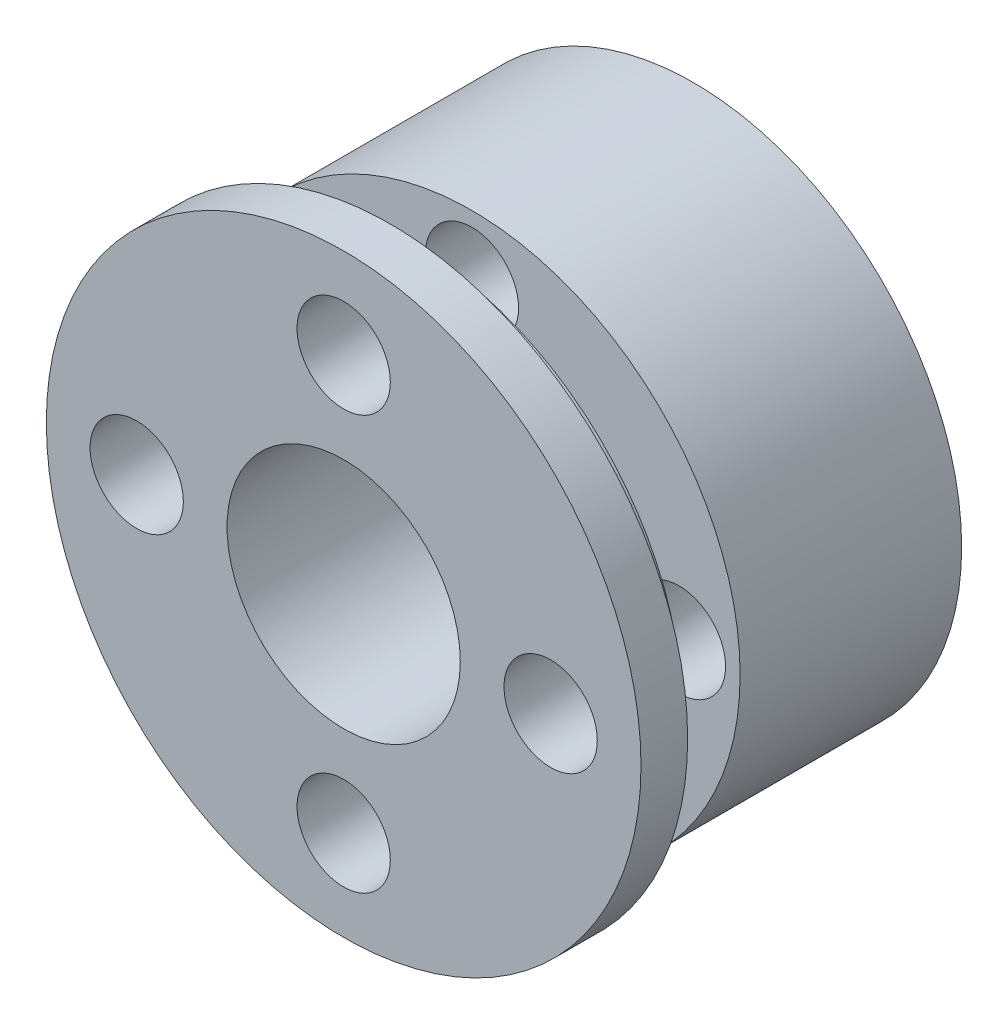
ISO-10303-21;
HEADER;
FILE_DESCRIPTION(('STEP AP214'),'2;1');
FILE_NAME('part.step','',(''),(''),'','','');
FILE_SCHEMA(('AUTOMOTIVE_DESIGN { 1 0 10303 214 1 1 1 1 }'));
ENDSEC;
DATA;
#1=APPLICATION_CONTEXT('core data for automotive mechanical design processes');
#2=APPLICATION_PROTOCOL_DEFINITION('international standard','automotive_design',2000,#1);
#3=PRODUCT_CONTEXT('',#1,'mechanical');
#4=PRODUCT('Part','Part','',(#3));
#5=PRODUCT_RELATED_PRODUCT_CATEGORY('part','',(#4));
#6=PRODUCT_DEFINITION_FORMATION('','',#4);
#7=PRODUCT_DEFINITION_CONTEXT('part definition',#1,'design');
#8=PRODUCT_DEFINITION('design','',#6,#7);
#9=PRODUCT_DEFINITION_SHAPE('','',#8);
#10=(LENGTH_UNIT() NAMED_UNIT(*) SI_UNIT(.MILLI.,.METRE.));
#11=(NAMED_UNIT(*) PLANE_ANGLE_UNIT() SI_UNIT($,.RADIAN.));
#12=(NAMED_UNIT(*) SI_UNIT($,.STERADIAN.) SOLID_ANGLE_UNIT());
#13=UNCERTAINTY_MEASURE_WITH_UNIT(LENGTH_MEASURE(1.E-05),#10,'distance_accuracy_value','');
#14=(GEOMETRIC_REPRESENTATION_CONTEXT(3) GLOBAL_UNCERTAINTY_ASSIGNED_CONTEXT((#13)) GLOBAL_UNIT_ASSIGNED_CONTEXT((#10,
#11,#12)) REPRESENTATION_CONTEXT('',''));
#15=CARTESIAN_POINT('',(0.,0.,0.));
#16=DIRECTION('',(0.,0.,1.));
#17=DIRECTION('',(1.,0.,0.));
#18=AXIS2_PLACEMENT_3D('',#15,#16,#17);
#19=CARTESIAN_POINT('',(0.,0.,0.));
#20=DIRECTION('',(0.,0.,1.));
#21=DIRECTION('',(1.,0.,0.));
#22=AXIS2_PLACEMENT_3D('',#19,#20,#21);
#23=PLANE('',#22);
#24=CARTESIAN_POINT('',(0.,8.875,0.));
#25=DIRECTION('',(0.,0.,1.));
#26=DIRECTION('',(1.,0.,0.));
#27=AXIS2_PLACEMENT_3D('',#24,#25,#26);
#28=CIRCLE('',#27,2.);
#29=CARTESIAN_POINT('',(2.,8.875,0.));
#30=VERTEX_POINT('',#29);
#31=EDGE_CURVE('E92',#30,#30,#28,.T.);
#32=ORIENTED_EDGE('',*,*,#31,.T.);
#33=EDGE_LOOP('',(#32));
#34=FACE_BOUND('',#33,.T.);
#35=CARTESIAN_POINT('',(8.87500000000025,2.50612360143471E-13,0.));
#36=DIRECTION('',(0.,0.,1.));
#37=DIRECTION('',(1.,0.,0.));
#38=AXIS2_PLACEMENT_3D('',#35,#36,#37);
#39=CIRCLE('',#38,2.0000000000002);
#40=CARTESIAN_POINT('',(10.8750000000004,2.50612360143471E-13,0.));
#41=VERTEX_POINT('',#40);
#42=EDGE_CURVE('E108',#41,#41,#39,.T.);
#43=ORIENTED_EDGE('',*,*,#42,.T.);
#44=EDGE_LOOP('',(#43));
#45=FACE_BOUND('',#44,.T.);
#46=CARTESIAN_POINT('',(5.01224720286941E-13,-8.875,0.));
#47=DIRECTION('',(0.,0.,1.));
#48=DIRECTION('',(1.,0.,0.));
#49=AXIS2_PLACEMENT_3D('',#46,#47,#48);
#50=CIRCLE('',#49,2.00000000000054);
#51=CARTESIAN_POINT('',(2.00000000000104,-8.875,0.));
#52=VERTEX_POINT('',#51);
#53=EDGE_CURVE('E102',#52,#52,#50,.T.);
#54=ORIENTED_EDGE('',*,*,#53,.T.);
#55=EDGE_LOOP('',(#54));
#56=FACE_BOUND('',#55,.T.);
#57=CARTESIAN_POINT('',(-8.87499999999975,-2.51699234177714E-13,0.));
#58=DIRECTION('',(0.,0.,1.));
#59=DIRECTION('',(1.,0.,0.));
#60=AXIS2_PLACEMENT_3D('',#57,#58,#59);
#61=CIRCLE('',#60,2.0000000000004);
#62=CARTESIAN_POINT('',(-6.87499999999935,-2.51699234177714E-13,0.));
#63=VERTEX_POINT('',#62);
#64=EDGE_CURVE('E96',#63,#63,#61,.T.);
#65=ORIENTED_EDGE('',*,*,#64,.T.);
#66=EDGE_LOOP('',(#65));
#67=FACE_BOUND('',#66,.T.);
#68=CARTESIAN_POINT('',(0.,0.,0.));
#69=DIRECTION('',(0.,0.,1.));
#70=DIRECTION('',(1.,0.,0.));
#71=AXIS2_PLACEMENT_3D('',#68,#69,#70);
#72=CIRCLE('',#71,5.);
#73=CARTESIAN_POINT('',(5.,0.,0.));
#74=VERTEX_POINT('',#73);
#75=EDGE_CURVE('E62',#74,#74,#72,.T.);
#76=ORIENTED_EDGE('',*,*,#75,.T.);
#77=EDGE_LOOP('',(#76));
#78=FACE_BOUND('',#77,.T.);
#79=CARTESIAN_POINT('',(0.,0.,0.));
#80=DIRECTION('',(0.,0.,1.));
#81=DIRECTION('',(1.,0.,0.));
#82=AXIS2_PLACEMENT_3D('',#79,#80,#81);
#83=CIRCLE('',#82,11.5);
#84=CARTESIAN_POINT('',(11.5,0.,0.));
#85=VERTEX_POINT('',#84);
#86=EDGE_CURVE('E10',#85,#85,#83,.T.);
#87=ORIENTED_EDGE('',*,*,#86,.F.);
#88=EDGE_LOOP('',(#87));
#89=FACE_BOUND('',#88,.T.);
#90=ADVANCED_FACE('F31',(#34,#45,#56,#67,#78,#89),#23,.F.);
#91=CARTESIAN_POINT('',(0.,0.,15.));
#92=DIRECTION('',(0.,0.,1.));
#93=DIRECTION('',(1.,0.,0.));
#94=AXIS2_PLACEMENT_3D('',#91,#92,#93);
#95=CYLINDRICAL_SURFACE('',#94,11.5);
#96=CARTESIAN_POINT('',(0.,0.,9.5));
#97=DIRECTION('',(0.,0.,1.));
#98=DIRECTION('',(1.,0.,0.));
#99=AXIS2_PLACEMENT_3D('',#96,#97,#98);
#100=CIRCLE('',#99,11.5);
#101=CARTESIAN_POINT('',(11.5,0.,9.5));
#102=VERTEX_POINT('',#101);
#103=EDGE_CURVE('E37',#102,#102,#100,.T.);
#104=ORIENTED_EDGE('',*,*,#103,.F.);
#105=EDGE_LOOP('',(#104));
#106=FACE_BOUND('',#105,.T.);
#107=ORIENTED_EDGE('',*,*,#86,.T.);
#108=EDGE_LOOP('',(#107));
#109=FACE_BOUND('',#108,.T.);
#110=ADVANCED_FACE('F131',(#106,#109),#95,.T.);
#111=CARTESIAN_POINT('',(0.,11.5,9.5));
#112=DIRECTION('',(0.,0.,-1.));
#113=DIRECTION('',(-1.,0.,0.));
#114=AXIS2_PLACEMENT_3D('',#111,#112,#113);
#115=PLANE('',#114);
#116=CARTESIAN_POINT('',(0.,8.875,9.5));
#117=DIRECTION('',(0.,0.,-1.));
#118=DIRECTION('',(-1.,0.,0.));
#119=AXIS2_PLACEMENT_3D('',#116,#117,#118);
#120=CIRCLE('',#119,2.);
#121=CARTESIAN_POINT('',(-2.,8.875,9.5));
#122=VERTEX_POINT('',#121);
#123=EDGE_CURVE('E66',#122,#122,#120,.T.);
#124=ORIENTED_EDGE('',*,*,#123,.T.);
#125=EDGE_LOOP('',(#124));
#126=FACE_BOUND('',#125,.T.);
#127=CARTESIAN_POINT('',(8.87500000000025,2.50612360143471E-13,9.5));
#128=DIRECTION('',(0.,0.,-1.));
#129=DIRECTION('',(-1.,0.,0.));
#130=AXIS2_PLACEMENT_3D('',#127,#128,#129);
#131=CIRCLE('',#130,2.0000000000002);
#132=CARTESIAN_POINT('',(6.87500000000005,2.50612360143471E-13,9.5));
#133=VERTEX_POINT('',#132);
#134=EDGE_CURVE('E74',#133,#133,#131,.T.);
#135=ORIENTED_EDGE('',*,*,#134,.T.);
#136=EDGE_LOOP('',(#135));
#137=FACE_BOUND('',#136,.T.);
#138=CARTESIAN_POINT('',(5.01224720286941E-13,-8.875,9.5));
#139=DIRECTION('',(0.,0.,-1.));
#140=DIRECTION('',(-1.,0.,0.));
#141=AXIS2_PLACEMENT_3D('',#138,#139,#140);
#142=CIRCLE('',#141,2.00000000000054);
#143=CARTESIAN_POINT('',(-2.00000000000004,-8.875,9.5));
#144=VERTEX_POINT('',#143);
#145=EDGE_CURVE('E80',#144,#144,#142,.T.);
#146=ORIENTED_EDGE('',*,*,#145,.T.);
#147=EDGE_LOOP('',(#146));
#148=FACE_BOUND('',#147,.T.);
#149=CARTESIAN_POINT('',(-8.87499999999975,-2.51699234177714E-13,9.5));
#150=DIRECTION('',(0.,0.,-1.));
#151=DIRECTION('',(-1.,0.,0.));
#152=AXIS2_PLACEMENT_3D('',#149,#150,#151);
#153=CIRCLE('',#152,2.0000000000004);
#154=CARTESIAN_POINT('',(-10.8750000000002,-2.51699234177714E-13,9.5));
#155=VERTEX_POINT('',#154);
#156=EDGE_CURVE('E86',#155,#155,#153,.T.);
#157=ORIENTED_EDGE('',*,*,#156,.T.);
#158=EDGE_LOOP('',(#157));
#159=FACE_BOUND('',#158,.T.);
#160=CARTESIAN_POINT('',(0.,0.,9.5));
#161=DIRECTION('',(0.,0.,1.));
#162=DIRECTION('',(1.,0.,0.));
#163=AXIS2_PLACEMENT_3D('',#160,#161,#162);
#164=CIRCLE('',#163,6.);
#165=CARTESIAN_POINT('',(6.,0.,9.5));
#166=VERTEX_POINT('',#165);
#167=EDGE_CURVE('E41',#166,#166,#164,.T.);
#168=ORIENTED_EDGE('',*,*,#167,.F.);
#169=EDGE_LOOP('',(#168));
#170=FACE_BOUND('',#169,.T.);
#171=ORIENTED_EDGE('',*,*,#103,.T.);
#172=EDGE_LOOP('',(#171));
#173=FACE_BOUND('',#172,.T.);
#174=ADVANCED_FACE('F127',(#126,#137,#148,#159,#170,#173),#115,.F.);
#175=CARTESIAN_POINT('',(0.,0.,15.));
#176=DIRECTION('',(0.,0.,1.));
#177=DIRECTION('',(1.,0.,0.));
#178=AXIS2_PLACEMENT_3D('',#175,#176,#177);
#179=CYLINDRICAL_SURFACE('',#178,6.);
#180=CARTESIAN_POINT('',(0.,0.,12.));
#181=DIRECTION('',(0.,0.,1.));
#182=DIRECTION('',(1.,0.,0.));
#183=AXIS2_PLACEMENT_3D('',#180,#181,#182);
#184=CIRCLE('',#183,6.);
#185=CARTESIAN_POINT('',(6.,0.,12.));
#186=VERTEX_POINT('',#185);
#187=EDGE_CURVE('E45',#186,#186,#184,.T.);
#188=ORIENTED_EDGE('',*,*,#187,.F.);
#189=EDGE_LOOP('',(#188));
#190=FACE_BOUND('',#189,.T.);
#191=ORIENTED_EDGE('',*,*,#167,.T.);
#192=EDGE_LOOP('',(#191));
#193=FACE_BOUND('',#192,.T.);
#194=ADVANCED_FACE('F130',(#190,#193),#179,.T.);
#195=CARTESIAN_POINT('',(0.,6.,12.));
#196=DIRECTION('',(0.,0.,1.));
#197=DIRECTION('',(1.,0.,0.));
#198=AXIS2_PLACEMENT_3D('',#195,#196,#197);
#199=PLANE('',#198);
#200=CARTESIAN_POINT('',(0.,8.875,12.));
#201=DIRECTION('',(0.,0.,1.));
#202=DIRECTION('',(1.,0.,0.));
#203=AXIS2_PLACEMENT_3D('',#200,#201,#202);
#204=CIRCLE('',#203,2.);
#205=CARTESIAN_POINT('',(2.,8.875,12.));
#206=VERTEX_POINT('',#205);
#207=EDGE_CURVE('E71',#206,#206,#204,.T.);
#208=ORIENTED_EDGE('',*,*,#207,.T.);
#209=EDGE_LOOP('',(#208));
#210=FACE_BOUND('',#209,.T.);
#211=CARTESIAN_POINT('',(8.87500000000025,2.50612360143471E-13,12.));
#212=DIRECTION('',(0.,0.,1.));
#213=DIRECTION('',(1.,0.,0.));
#214=AXIS2_PLACEMENT_3D('',#211,#212,#213);
#215=CIRCLE('',#214,2.0000000000002);
#216=CARTESIAN_POINT('',(10.8750000000004,2.50612360143471E-13,12.));
#217=VERTEX_POINT('',#216);
#218=EDGE_CURVE('E77',#217,#217,#215,.T.);
#219=ORIENTED_EDGE('',*,*,#218,.T.);
#220=EDGE_LOOP('',(#219));
#221=FACE_BOUND('',#220,.T.);
#222=CARTESIAN_POINT('',(5.01224720286941E-13,-8.875,12.));
#223=DIRECTION('',(0.,0.,1.));
#224=DIRECTION('',(1.,0.,0.));
#225=AXIS2_PLACEMENT_3D('',#222,#223,#224);
#226=CIRCLE('',#225,2.00000000000054);
#227=CARTESIAN_POINT('',(2.00000000000104,-8.875,12.));
#228=VERTEX_POINT('',#227);
#229=EDGE_CURVE('E83',#228,#228,#226,.T.);
#230=ORIENTED_EDGE('',*,*,#229,.T.);
#231=EDGE_LOOP('',(#230));
#232=FACE_BOUND('',#231,.T.);
#233=CARTESIAN_POINT('',(-8.87499999999975,-2.51699234177714E-13,12.));
#234=DIRECTION('',(0.,0.,1.));
#235=DIRECTION('',(1.,0.,0.));
#236=AXIS2_PLACEMENT_3D('',#233,#234,#235);
#237=CIRCLE('',#236,2.0000000000004);
#238=CARTESIAN_POINT('',(-6.87499999999935,-2.51699234177714E-13,12.));
#239=VERTEX_POINT('',#238);
#240=EDGE_CURVE('E89',#239,#239,#237,.T.);
#241=ORIENTED_EDGE('',*,*,#240,.T.);
#242=EDGE_LOOP('',(#241));
#243=FACE_BOUND('',#242,.T.);
#244=CARTESIAN_POINT('',(0.,0.,12.));
#245=DIRECTION('',(0.,0.,1.));
#246=DIRECTION('',(1.,0.,0.));
#247=AXIS2_PLACEMENT_3D('',#244,#245,#246);
#248=CIRCLE('',#247,11.5);
#249=CARTESIAN_POINT('',(11.5,0.,12.));
#250=VERTEX_POINT('',#249);
#251=EDGE_CURVE('E50',#250,#250,#248,.T.);
#252=ORIENTED_EDGE('',*,*,#251,.F.);
#253=EDGE_LOOP('',(#252));
#254=FACE_BOUND('',#253,.T.);
#255=ORIENTED_EDGE('',*,*,#187,.T.);
#256=EDGE_LOOP('',(#255));
#257=FACE_BOUND('',#256,.T.);
#258=ADVANCED_FACE('F142',(#210,#221,#232,#243,#254,#257),#199,.F.);
#259=CARTESIAN_POINT('',(0.,0.,15.));
#260=DIRECTION('',(0.,0.,1.));
#261=DIRECTION('',(1.,0.,0.));
#262=AXIS2_PLACEMENT_3D('',#259,#260,#261);
#263=CYLINDRICAL_SURFACE('',#262,11.5);
#264=CARTESIAN_POINT('',(0.,0.,13.));
#265=DIRECTION('',(0.,0.,1.));
#266=DIRECTION('',(1.,0.,0.));
#267=AXIS2_PLACEMENT_3D('',#264,#265,#266);
#268=CIRCLE('',#267,11.5);
#269=CARTESIAN_POINT('',(11.5,0.,13.));
#270=VERTEX_POINT('',#269);
#271=EDGE_CURVE('E53',#270,#270,#268,.T.);
#272=ORIENTED_EDGE('',*,*,#271,.F.);
#273=EDGE_LOOP('',(#272));
#274=FACE_BOUND('',#273,.T.);
#275=ORIENTED_EDGE('',*,*,#251,.T.);
#276=EDGE_LOOP('',(#275));
#277=FACE_BOUND('',#276,.T.);
#278=ADVANCED_FACE('F148',(#274,#277),#263,.T.);
#279=CARTESIAN_POINT('',(0.,11.5,13.));
#280=DIRECTION('',(0.,0.,1.));
#281=DIRECTION('',(1.,0.,0.));
#282=AXIS2_PLACEMENT_3D('',#279,#280,#281);
#283=PLANE('',#282);
#284=CARTESIAN_POINT('',(0.,0.,13.));
#285=DIRECTION('',(0.,0.,1.));
#286=DIRECTION('',(1.,0.,0.));
#287=AXIS2_PLACEMENT_3D('',#284,#285,#286);
#288=CIRCLE('',#287,12.75);
#289=CARTESIAN_POINT('',(12.75,0.,13.));
#290=VERTEX_POINT('',#289);
#291=EDGE_CURVE('E56',#290,#290,#288,.T.);
#292=ORIENTED_EDGE('',*,*,#291,.F.);
#293=EDGE_LOOP('',(#292));
#294=FACE_BOUND('',#293,.T.);
#295=ORIENTED_EDGE('',*,*,#271,.T.);
#296=EDGE_LOOP('',(#295));
#297=FACE_BOUND('',#296,.T.);
#298=ADVANCED_FACE('F271',(#294,#297),#283,.F.);
#299=CARTESIAN_POINT('',(0.,0.,15.));
#300=DIRECTION('',(0.,0.,1.));
#301=DIRECTION('',(1.,0.,0.));
#302=AXIS2_PLACEMENT_3D('',#299,#300,#301);
#303=CYLINDRICAL_SURFACE('',#302,12.75);
#304=CARTESIAN_POINT('',(0.,0.,15.));
#305=DIRECTION('',(0.,0.,1.));
#306=DIRECTION('',(1.,0.,0.));
#307=AXIS2_PLACEMENT_3D('',#304,#305,#306);
#308=CIRCLE('',#307,12.75);
#309=CARTESIAN_POINT('',(12.75,0.,15.));
#310=VERTEX_POINT('',#309);
#311=EDGE_CURVE('E59',#310,#310,#308,.T.);
#312=ORIENTED_EDGE('',*,*,#311,.F.);
#313=EDGE_LOOP('',(#312));
#314=FACE_BOUND('',#313,.T.);
#315=ORIENTED_EDGE('',*,*,#291,.T.);
#316=EDGE_LOOP('',(#315));
#317=FACE_BOUND('',#316,.T.);
#318=ADVANCED_FACE('F186',(#314,#317),#303,.T.);
#319=CARTESIAN_POINT('',(0.,12.75,15.));
#320=DIRECTION('',(0.,0.,-1.));
#321=DIRECTION('',(-1.,0.,0.));
#322=AXIS2_PLACEMENT_3D('',#319,#320,#321);
#323=PLANE('',#322);
#324=CARTESIAN_POINT('',(0.,8.875,15.));
#325=DIRECTION('',(0.,0.,1.));
#326=DIRECTION('',(1.,0.,0.));
#327=AXIS2_PLACEMENT_3D('',#324,#325,#326);
#328=CIRCLE('',#327,2.);
#329=CARTESIAN_POINT('',(2.,8.875,15.));
#330=VERTEX_POINT('',#329);
#331=EDGE_CURVE('E111',#330,#330,#328,.T.);
#332=ORIENTED_EDGE('',*,*,#331,.F.);
#333=EDGE_LOOP('',(#332));
#334=FACE_BOUND('',#333,.T.);
#335=CARTESIAN_POINT('',(8.87500000000025,2.50612360143471E-13,15.));
#336=DIRECTION('',(0.,0.,1.));
#337=DIRECTION('',(1.,0.,0.));
#338=AXIS2_PLACEMENT_3D('',#335,#336,#337);
#339=CIRCLE('',#338,2.0000000000002);
#340=CARTESIAN_POINT('',(10.8750000000004,2.50612360143471E-13,15.));
#341=VERTEX_POINT('',#340);
#342=EDGE_CURVE('E105',#341,#341,#339,.T.);
#343=ORIENTED_EDGE('',*,*,#342,.F.);
#344=EDGE_LOOP('',(#343));
#345=FACE_BOUND('',#344,.T.);
#346=CARTESIAN_POINT('',(5.01224720286941E-13,-8.875,15.));
#347=DIRECTION('',(0.,0.,1.));
#348=DIRECTION('',(1.,0.,0.));
#349=AXIS2_PLACEMENT_3D('',#346,#347,#348);
#350=CIRCLE('',#349,2.00000000000054);
#351=CARTESIAN_POINT('',(2.00000000000104,-8.875,15.));
#352=VERTEX_POINT('',#351);
#353=EDGE_CURVE('E99',#352,#352,#350,.T.);
#354=ORIENTED_EDGE('',*,*,#353,.F.);
#355=EDGE_LOOP('',(#354));
#356=FACE_BOUND('',#355,.T.);
#357=CARTESIAN_POINT('',(-8.87499999999975,-2.51699234177714E-13,15.));
#358=DIRECTION('',(0.,0.,1.));
#359=DIRECTION('',(1.,0.,0.));
#360=AXIS2_PLACEMENT_3D('',#357,#358,#359);
#361=CIRCLE('',#360,2.0000000000004);
#362=CARTESIAN_POINT('',(-6.87499999999935,-2.51699234177714E-13,15.));
#363=VERTEX_POINT('',#362);
#364=EDGE_CURVE('E93',#363,#363,#361,.T.);
#365=ORIENTED_EDGE('',*,*,#364,.F.);
#366=EDGE_LOOP('',(#365));
#367=FACE_BOUND('',#366,.T.);
#368=CARTESIAN_POINT('',(0.,0.,15.));
#369=DIRECTION('',(0.,0.,1.));
#370=DIRECTION('',(1.,0.,0.));
#371=AXIS2_PLACEMENT_3D('',#368,#369,#370);
#372=CIRCLE('',#371,5.);
#373=CARTESIAN_POINT('',(5.,0.,15.));
#374=VERTEX_POINT('',#373);
#375=EDGE_CURVE('E63',#374,#374,#372,.T.);
#376=ORIENTED_EDGE('',*,*,#375,.F.);
#377=EDGE_LOOP('',(#376));
#378=FACE_BOUND('',#377,.T.);
#379=ORIENTED_EDGE('',*,*,#311,.T.);
#380=EDGE_LOOP('',(#379));
#381=FACE_BOUND('',#380,.T.);
#382=ADVANCED_FACE('F180',(#334,#345,#356,#367,#378,#381),#323,.F.);
#383=CARTESIAN_POINT('',(0.,0.,0.));
#384=DIRECTION('',(0.,0.,1.));
#385=DIRECTION('',(1.,0.,0.));
#386=AXIS2_PLACEMENT_3D('',#383,#384,#385);
#387=CYLINDRICAL_SURFACE('',#386,5.);
#388=ORIENTED_EDGE('',*,*,#75,.F.);
#389=EDGE_LOOP('',(#388));
#390=FACE_BOUND('',#389,.T.);
#391=ORIENTED_EDGE('',*,*,#375,.T.);
#392=EDGE_LOOP('',(#391));
#393=FACE_BOUND('',#392,.T.);
#394=ADVANCED_FACE('F185',(#390,#393),#387,.F.);
#395=CARTESIAN_POINT('',(-8.87499999999975,-2.51699234177714E-13,0.));
#396=DIRECTION('',(0.,0.,1.));
#397=DIRECTION('',(1.,0.,0.));
#398=AXIS2_PLACEMENT_3D('',#395,#396,#397);
#399=CYLINDRICAL_SURFACE('',#398,2.0000000000004);
#400=ORIENTED_EDGE('',*,*,#364,.T.);
#401=EDGE_LOOP('',(#400));
#402=FACE_BOUND('',#401,.T.);
#403=ORIENTED_EDGE('',*,*,#240,.F.);
#404=EDGE_LOOP('',(#403));
#405=FACE_BOUND('',#404,.T.);
#406=ADVANCED_FACE('F196',(#402,#405),#399,.F.);
#407=CARTESIAN_POINT('',(5.01224720286941E-13,-8.875,0.));
#408=DIRECTION('',(0.,0.,1.));
#409=DIRECTION('',(1.,0.,0.));
#410=AXIS2_PLACEMENT_3D('',#407,#408,#409);
#411=CYLINDRICAL_SURFACE('',#410,2.00000000000054);
#412=ORIENTED_EDGE('',*,*,#353,.T.);
#413=EDGE_LOOP('',(#412));
#414=FACE_BOUND('',#413,.T.);
#415=ORIENTED_EDGE('',*,*,#229,.F.);
#416=EDGE_LOOP('',(#415));
#417=FACE_BOUND('',#416,.T.);
#418=ADVANCED_FACE('F201',(#414,#417),#411,.F.);
#419=CARTESIAN_POINT('',(8.87500000000025,2.50612360143471E-13,0.));
#420=DIRECTION('',(0.,0.,1.));
#421=DIRECTION('',(1.,0.,0.));
#422=AXIS2_PLACEMENT_3D('',#419,#420,#421);
#423=CYLINDRICAL_SURFACE('',#422,2.0000000000002);
#424=ORIENTED_EDGE('',*,*,#342,.T.);
#425=EDGE_LOOP('',(#424));
#426=FACE_BOUND('',#425,.T.);
#427=ORIENTED_EDGE('',*,*,#218,.F.);
#428=EDGE_LOOP('',(#427));
#429=FACE_BOUND('',#428,.T.);
#430=ADVANCED_FACE('F212',(#426,#429),#423,.F.);
#431=CARTESIAN_POINT('',(0.,8.875,0.));
#432=DIRECTION('',(0.,0.,1.));
#433=DIRECTION('',(1.,0.,0.));
#434=AXIS2_PLACEMENT_3D('',#431,#432,#433);
#435=CYLINDRICAL_SURFACE('',#434,2.);
#436=ORIENTED_EDGE('',*,*,#331,.T.);
#437=EDGE_LOOP('',(#436));
#438=FACE_BOUND('',#437,.T.);
#439=ORIENTED_EDGE('',*,*,#207,.F.);
#440=EDGE_LOOP('',(#439));
#441=FACE_BOUND('',#440,.T.);
#442=ADVANCED_FACE('F124',(#438,#441),#435,.F.);
#443=ORIENTED_EDGE('',*,*,#64,.F.);
#444=EDGE_LOOP('',(#443));
#445=FACE_BOUND('',#444,.T.);
#446=ORIENTED_EDGE('',*,*,#156,.F.);
#447=EDGE_LOOP('',(#446));
#448=FACE_BOUND('',#447,.T.);
#449=ADVANCED_FACE('F204',(#445,#448),#399,.F.);
#450=ORIENTED_EDGE('',*,*,#53,.F.);
#451=EDGE_LOOP('',(#450));
#452=FACE_BOUND('',#451,.T.);
#453=ORIENTED_EDGE('',*,*,#145,.F.);
#454=EDGE_LOOP('',(#453));
#455=FACE_BOUND('',#454,.T.);
#456=ADVANCED_FACE('F215',(#452,#455),#411,.F.);
#457=ORIENTED_EDGE('',*,*,#42,.F.);
#458=EDGE_LOOP('',(#457));
#459=FACE_BOUND('',#458,.T.);
#460=ORIENTED_EDGE('',*,*,#134,.F.);
#461=EDGE_LOOP('',(#460));
#462=FACE_BOUND('',#461,.T.);
#463=ADVANCED_FACE('F122',(#459,#462),#423,.F.);
#464=ORIENTED_EDGE('',*,*,#31,.F.);
#465=EDGE_LOOP('',(#464));
#466=FACE_BOUND('',#465,.T.);
#467=ORIENTED_EDGE('',*,*,#123,.F.);
#468=EDGE_LOOP('',(#467));
#469=FACE_BOUND('',#468,.T.);
#470=ADVANCED_FACE('F119',(#466,#469),#435,.F.);
#471=CLOSED_SHELL('',(#90,#110,#174,#194,#258,#278,#298,#318,#382,#394,#406,#418,#430,#442,#449,
#456,#463,#470));
#472=MANIFOLD_SOLID_BREP('B2',#471);
#473=ADVANCED_BREP_SHAPE_REPRESENTATION('',(#18,#472),#14);
#474=SHAPE_DEFINITION_REPRESENTATION(#9,#473);
ENDSEC;
END-ISO-10303-21;
